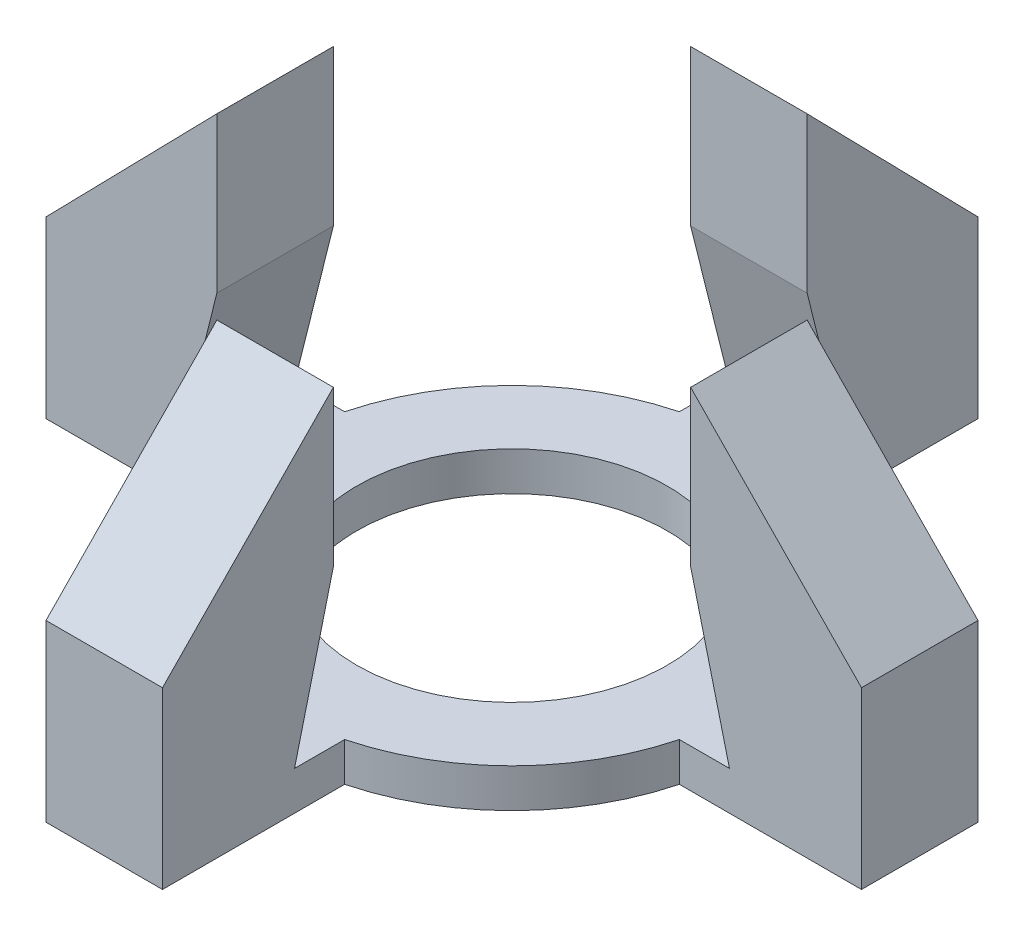
ISO-10303-21;
HEADER;
FILE_DESCRIPTION(('STEP AP214'),'2;1');
FILE_NAME('part.step','',(''),(''),'','','');
FILE_SCHEMA(('AUTOMOTIVE_DESIGN { 1 0 10303 214 1 1 1 1 }'));
ENDSEC;
DATA;
#1=APPLICATION_CONTEXT('core data for automotive mechanical design processes');
#2=APPLICATION_PROTOCOL_DEFINITION('international standard','automotive_design',2000,#1);
#3=PRODUCT_CONTEXT('',#1,'mechanical');
#4=PRODUCT('Part','Part','',(#3));
#5=PRODUCT_RELATED_PRODUCT_CATEGORY('part','',(#4));
#6=PRODUCT_DEFINITION_FORMATION('','',#4);
#7=PRODUCT_DEFINITION_CONTEXT('part definition',#1,'design');
#8=PRODUCT_DEFINITION('design','',#6,#7);
#9=PRODUCT_DEFINITION_SHAPE('','',#8);
#10=(LENGTH_UNIT() NAMED_UNIT(*) SI_UNIT(.MILLI.,.METRE.));
#11=(NAMED_UNIT(*) PLANE_ANGLE_UNIT() SI_UNIT($,.RADIAN.));
#12=(NAMED_UNIT(*) SI_UNIT($,.STERADIAN.) SOLID_ANGLE_UNIT());
#13=UNCERTAINTY_MEASURE_WITH_UNIT(LENGTH_MEASURE(1.E-05),#10,'distance_accuracy_value','');
#14=(GEOMETRIC_REPRESENTATION_CONTEXT(3) GLOBAL_UNCERTAINTY_ASSIGNED_CONTEXT((#13)) GLOBAL_UNIT_ASSIGNED_CONTEXT((#10,
#11,#12)) REPRESENTATION_CONTEXT('',''));
#15=CARTESIAN_POINT('',(0.,0.,0.));
#16=DIRECTION('',(0.,0.,1.));
#17=DIRECTION('',(1.,0.,0.));
#18=AXIS2_PLACEMENT_3D('',#15,#16,#17);
#19=CARTESIAN_POINT('',(-7.5,5.,0.));
#20=DIRECTION('',(1.,0.,0.));
#21=DIRECTION('',(0.,0.,-1.));
#22=AXIS2_PLACEMENT_3D('',#19,#20,#21);
#23=PLANE('',#22);
#24=DIRECTION('',(0.,0.970142500145332,-0.242535625036333));
#25=VECTOR('',#24,1.);
#26=CARTESIAN_POINT('',(-7.49999999999999,8.64705882352941,34.5882352941177));
#27=LINE('',#26,#25);
#28=CARTESIAN_POINT('',(-7.49999999999999,5.,35.5));
#29=VERTEX_POINT('',#28);
#30=CARTESIAN_POINT('',(-7.5,25.,30.5));
#31=VERTEX_POINT('',#30);
#32=EDGE_CURVE('E135',#29,#31,#27,.T.);
#33=ORIENTED_EDGE('',*,*,#32,.F.);
#34=DIRECTION('',(0.,0.,1.));
#35=VECTOR('',#34,1.);
#36=CARTESIAN_POINT('',(-7.5,5.,0.));
#37=LINE('',#36,#35);
#38=CARTESIAN_POINT('',(-7.5,5.,29.0473750965556));
#39=VERTEX_POINT('',#38);
#40=EDGE_CURVE('E344',#39,#29,#37,.T.);
#41=ORIENTED_EDGE('',*,*,#40,.F.);
#42=DIRECTION('',(0.,-1.,0.));
#43=VECTOR('',#42,1.);
#44=CARTESIAN_POINT('',(-7.5,5.,29.0473750965556));
#45=LINE('',#44,#43);
#46=CARTESIAN_POINT('',(-7.5,0.,29.0473750965556));
#47=VERTEX_POINT('',#46);
#48=EDGE_CURVE('E12',#39,#47,#45,.T.);
#49=ORIENTED_EDGE('',*,*,#48,.T.);
#50=DIRECTION('',(0.,0.,1.));
#51=VECTOR('',#50,1.);
#52=CARTESIAN_POINT('',(-7.5,0.,0.));
#53=LINE('',#52,#51);
#54=CARTESIAN_POINT('',(-7.5,0.,52.5));
#55=VERTEX_POINT('',#54);
#56=EDGE_CURVE('E386',#47,#55,#53,.T.);
#57=ORIENTED_EDGE('',*,*,#56,.T.);
#58=DIRECTION('',(0.,-1.,0.));
#59=VECTOR('',#58,1.);
#60=CARTESIAN_POINT('',(-7.5,5.,52.5));
#61=LINE('',#60,#59);
#62=CARTESIAN_POINT('',(-7.5,22.5,52.5));
#63=VERTEX_POINT('',#62);
#64=EDGE_CURVE('E128',#63,#55,#61,.T.);
#65=ORIENTED_EDGE('',*,*,#64,.F.);
#66=DIRECTION('',(0.,-0.715006669013058,0.699117631923879));
#67=VECTOR('',#66,1.);
#68=CARTESIAN_POINT('',(-7.49999999999999,37.2405958091391,38.0869729866196));
#69=LINE('',#68,#67);
#70=CARTESIAN_POINT('',(-7.49999999999999,45.,30.5));
#71=VERTEX_POINT('',#70);
#72=EDGE_CURVE('E526',#71,#63,#69,.T.);
#73=ORIENTED_EDGE('',*,*,#72,.F.);
#74=DIRECTION('',(0.,-1.,0.));
#75=VECTOR('',#74,1.);
#76=CARTESIAN_POINT('',(-7.5,45.,30.5));
#77=LINE('',#76,#75);
#78=EDGE_CURVE('E330',#71,#31,#77,.T.);
#79=ORIENTED_EDGE('',*,*,#78,.T.);
#80=EDGE_LOOP('',(#33,#41,#49,#57,#65,#73,#79));
#81=FACE_BOUND('',#80,.T.);
#82=ADVANCED_FACE('F119',(#81),#23,.F.);
#83=CARTESIAN_POINT('',(7.5,5.,0.));
#84=DIRECTION('',(-1.,0.,0.));
#85=DIRECTION('',(0.,0.,1.));
#86=AXIS2_PLACEMENT_3D('',#83,#84,#85);
#87=PLANE('',#86);
#88=DIRECTION('',(0.,0.,-1.));
#89=VECTOR('',#88,1.);
#90=CARTESIAN_POINT('',(7.5,5.,0.));
#91=LINE('',#90,#89);
#92=CARTESIAN_POINT('',(7.5,5.,35.5));
#93=VERTEX_POINT('',#92);
#94=CARTESIAN_POINT('',(7.5,5.,29.0473750965556));
#95=VERTEX_POINT('',#94);
#96=EDGE_CURVE('E323',#93,#95,#91,.T.);
#97=ORIENTED_EDGE('',*,*,#96,.F.);
#98=DIRECTION('',(0.,-0.970142500145332,0.242535625036333));
#99=VECTOR('',#98,1.);
#100=CARTESIAN_POINT('',(7.5,8.64705882352941,34.5882352941177));
#101=LINE('',#100,#99);
#102=CARTESIAN_POINT('',(7.5,25.,30.5));
#103=VERTEX_POINT('',#102);
#104=EDGE_CURVE('E308',#103,#93,#101,.T.);
#105=ORIENTED_EDGE('',*,*,#104,.F.);
#106=DIRECTION('',(0.,-1.,0.));
#107=VECTOR('',#106,1.);
#108=CARTESIAN_POINT('',(7.5,45.,30.5));
#109=LINE('',#108,#107);
#110=CARTESIAN_POINT('',(7.5,45.,30.5));
#111=VERTEX_POINT('',#110);
#112=EDGE_CURVE('E320',#111,#103,#109,.T.);
#113=ORIENTED_EDGE('',*,*,#112,.F.);
#114=DIRECTION('',(0.,0.715006669013058,-0.699117631923879));
#115=VECTOR('',#114,1.);
#116=CARTESIAN_POINT('',(7.5,37.2405958091391,38.0869729866196));
#117=LINE('',#116,#115);
#118=CARTESIAN_POINT('',(7.5,22.5,52.5));
#119=VERTEX_POINT('',#118);
#120=EDGE_CURVE('E519',#119,#111,#117,.T.);
#121=ORIENTED_EDGE('',*,*,#120,.F.);
#122=DIRECTION('',(0.,-1.,0.));
#123=VECTOR('',#122,1.);
#124=CARTESIAN_POINT('',(7.5,5.,52.5));
#125=LINE('',#124,#123);
#126=CARTESIAN_POINT('',(7.5,0.,52.5));
#127=VERTEX_POINT('',#126);
#128=EDGE_CURVE('E488',#119,#127,#125,.T.);
#129=ORIENTED_EDGE('',*,*,#128,.T.);
#130=DIRECTION('',(0.,0.,-1.));
#131=VECTOR('',#130,1.);
#132=CARTESIAN_POINT('',(7.5,0.,0.));
#133=LINE('',#132,#131);
#134=CARTESIAN_POINT('',(7.5,0.,29.0473750965556));
#135=VERTEX_POINT('',#134);
#136=EDGE_CURVE('E395',#127,#135,#133,.T.);
#137=ORIENTED_EDGE('',*,*,#136,.T.);
#138=DIRECTION('',(0.,-1.,0.));
#139=VECTOR('',#138,1.);
#140=CARTESIAN_POINT('',(7.5,5.,29.0473750965556));
#141=LINE('',#140,#139);
#142=EDGE_CURVE('E484',#95,#135,#141,.T.);
#143=ORIENTED_EDGE('',*,*,#142,.F.);
#144=EDGE_LOOP('',(#97,#105,#113,#121,#129,#137,#143));
#145=FACE_BOUND('',#144,.T.);
#146=ADVANCED_FACE('F318',(#145),#87,.F.);
#147=CARTESIAN_POINT('',(0.,5.,7.50000000000002));
#148=DIRECTION('',(0.,0.,-1.));
#149=DIRECTION('',(-1.,0.,0.));
#150=AXIS2_PLACEMENT_3D('',#147,#148,#149);
#151=PLANE('',#150);
#152=DIRECTION('',(-0.242535625036333,0.970142500145332,0.));
#153=VECTOR('',#152,1.);
#154=CARTESIAN_POINT('',(34.5882352941177,8.64705882352942,7.50000000000001));
#155=LINE('',#154,#153);
#156=CARTESIAN_POINT('',(35.5,5.,7.50000000000001));
#157=VERTEX_POINT('',#156);
#158=CARTESIAN_POINT('',(30.5,25.,7.5));
#159=VERTEX_POINT('',#158);
#160=EDGE_CURVE('E143',#157,#159,#155,.T.);
#161=ORIENTED_EDGE('',*,*,#160,.F.);
#162=DIRECTION('',(1.,0.,0.));
#163=VECTOR('',#162,1.);
#164=CARTESIAN_POINT('',(0.,5.,7.50000000000002));
#165=LINE('',#164,#163);
#166=CARTESIAN_POINT('',(29.0473750965556,5.,7.5));
#167=VERTEX_POINT('',#166);
#168=EDGE_CURVE('E353',#167,#157,#165,.T.);
#169=ORIENTED_EDGE('',*,*,#168,.F.);
#170=DIRECTION('',(0.,-1.,0.));
#171=VECTOR('',#170,1.);
#172=CARTESIAN_POINT('',(29.0473750965556,5.,7.5));
#173=LINE('',#172,#171);
#174=CARTESIAN_POINT('',(29.0473750965556,0.,7.5));
#175=VERTEX_POINT('',#174);
#176=EDGE_CURVE('E480',#167,#175,#173,.T.);
#177=ORIENTED_EDGE('',*,*,#176,.T.);
#178=DIRECTION('',(1.,0.,0.));
#179=VECTOR('',#178,1.);
#180=CARTESIAN_POINT('',(0.,0.,7.50000000000002));
#181=LINE('',#180,#179);
#182=CARTESIAN_POINT('',(52.5,0.,7.49999999999999));
#183=VERTEX_POINT('',#182);
#184=EDGE_CURVE('E401',#175,#183,#181,.T.);
#185=ORIENTED_EDGE('',*,*,#184,.T.);
#186=DIRECTION('',(0.,-1.,0.));
#187=VECTOR('',#186,1.);
#188=CARTESIAN_POINT('',(52.5,5.,7.49999999999999));
#189=LINE('',#188,#187);
#190=CARTESIAN_POINT('',(52.5,22.5,7.49999999999999));
#191=VERTEX_POINT('',#190);
#192=EDGE_CURVE('E477',#191,#183,#189,.T.);
#193=ORIENTED_EDGE('',*,*,#192,.F.);
#194=DIRECTION('',(0.699117631923878,-0.715006669013058,0.));
#195=VECTOR('',#194,1.);
#196=CARTESIAN_POINT('',(38.0869729866196,37.2405958091391,7.49999999999999));
#197=LINE('',#196,#195);
#198=CARTESIAN_POINT('',(30.5,45.,7.5));
#199=VERTEX_POINT('',#198);
#200=EDGE_CURVE('E547',#199,#191,#197,.T.);
#201=ORIENTED_EDGE('',*,*,#200,.F.);
#202=DIRECTION('',(0.,-1.,0.));
#203=VECTOR('',#202,1.);
#204=CARTESIAN_POINT('',(30.5,45.,7.5));
#205=LINE('',#204,#203);
#206=EDGE_CURVE('E612',#199,#159,#205,.T.);
#207=ORIENTED_EDGE('',*,*,#206,.T.);
#208=EDGE_LOOP('',(#161,#169,#177,#185,#193,#201,#207));
#209=FACE_BOUND('',#208,.T.);
#210=ADVANCED_FACE('F630',(#209),#151,.F.);
#211=CARTESIAN_POINT('',(0.,5.,-7.49999999999999));
#212=DIRECTION('',(0.,0.,1.));
#213=DIRECTION('',(1.,0.,0.));
#214=AXIS2_PLACEMENT_3D('',#211,#212,#213);
#215=PLANE('',#214);
#216=DIRECTION('',(-1.,0.,0.));
#217=VECTOR('',#216,1.);
#218=CARTESIAN_POINT('',(0.,5.,-7.49999999999999));
#219=LINE('',#218,#217);
#220=CARTESIAN_POINT('',(35.5,5.,-7.5));
#221=VERTEX_POINT('',#220);
#222=CARTESIAN_POINT('',(29.0473750965556,5.,-7.5));
#223=VERTEX_POINT('',#222);
#224=EDGE_CURVE('E356',#221,#223,#219,.T.);
#225=ORIENTED_EDGE('',*,*,#224,.F.);
#226=DIRECTION('',(0.242535625036333,-0.970142500145332,0.));
#227=VECTOR('',#226,1.);
#228=CARTESIAN_POINT('',(34.5882352941177,8.64705882352942,-7.5));
#229=LINE('',#228,#227);
#230=CARTESIAN_POINT('',(30.5,25.,-7.5));
#231=VERTEX_POINT('',#230);
#232=EDGE_CURVE('E529',#231,#221,#229,.T.);
#233=ORIENTED_EDGE('',*,*,#232,.F.);
#234=DIRECTION('',(0.,-1.,0.));
#235=VECTOR('',#234,1.);
#236=CARTESIAN_POINT('',(30.5,45.,-7.5));
#237=LINE('',#236,#235);
#238=CARTESIAN_POINT('',(30.5,45.,-7.5));
#239=VERTEX_POINT('',#238);
#240=EDGE_CURVE('E622',#239,#231,#237,.T.);
#241=ORIENTED_EDGE('',*,*,#240,.F.);
#242=DIRECTION('',(-0.699117631923878,0.715006669013058,0.));
#243=VECTOR('',#242,1.);
#244=CARTESIAN_POINT('',(38.0869729866196,37.2405958091391,-7.5));
#245=LINE('',#244,#243);
#246=CARTESIAN_POINT('',(52.5,22.5,-7.50000000000001));
#247=VERTEX_POINT('',#246);
#248=EDGE_CURVE('E541',#247,#239,#245,.T.);
#249=ORIENTED_EDGE('',*,*,#248,.F.);
#250=DIRECTION('',(0.,-1.,0.));
#251=VECTOR('',#250,1.);
#252=CARTESIAN_POINT('',(52.5,5.,-7.50000000000001));
#253=LINE('',#252,#251);
#254=CARTESIAN_POINT('',(52.5,0.,-7.50000000000001));
#255=VERTEX_POINT('',#254);
#256=EDGE_CURVE('E474',#247,#255,#253,.T.);
#257=ORIENTED_EDGE('',*,*,#256,.T.);
#258=DIRECTION('',(-1.,0.,0.));
#259=VECTOR('',#258,1.);
#260=CARTESIAN_POINT('',(0.,0.,-7.49999999999999));
#261=LINE('',#260,#259);
#262=CARTESIAN_POINT('',(29.0473750965556,0.,-7.5));
#263=VERTEX_POINT('',#262);
#264=EDGE_CURVE('E409',#255,#263,#261,.T.);
#265=ORIENTED_EDGE('',*,*,#264,.T.);
#266=DIRECTION('',(0.,-1.,0.));
#267=VECTOR('',#266,1.);
#268=CARTESIAN_POINT('',(29.0473750965556,5.,-7.5));
#269=LINE('',#268,#267);
#270=EDGE_CURVE('E470',#223,#263,#269,.T.);
#271=ORIENTED_EDGE('',*,*,#270,.F.);
#272=EDGE_LOOP('',(#225,#233,#241,#249,#257,#265,#271));
#273=FACE_BOUND('',#272,.T.);
#274=ADVANCED_FACE('F638',(#273),#215,.F.);
#275=CARTESIAN_POINT('',(7.49999999999999,5.,0.));
#276=DIRECTION('',(-1.,0.,0.));
#277=DIRECTION('',(0.,0.,1.));
#278=AXIS2_PLACEMENT_3D('',#275,#276,#277);
#279=PLANE('',#278);
#280=DIRECTION('',(0.,0.970142500145332,0.242535625036333));
#281=VECTOR('',#280,1.);
#282=CARTESIAN_POINT('',(7.49999999999999,8.64705882352941,-34.5882352941177));
#283=LINE('',#282,#281);
#284=CARTESIAN_POINT('',(7.49999999999999,5.,-35.5));
#285=VERTEX_POINT('',#284);
#286=CARTESIAN_POINT('',(7.49999999999999,25.,-30.5));
#287=VERTEX_POINT('',#286);
#288=EDGE_CURVE('E559',#285,#287,#283,.T.);
#289=ORIENTED_EDGE('',*,*,#288,.F.);
#290=DIRECTION('',(0.,0.,-1.));
#291=VECTOR('',#290,1.);
#292=CARTESIAN_POINT('',(7.49999999999999,5.,0.));
#293=LINE('',#292,#291);
#294=CARTESIAN_POINT('',(7.49999999999999,5.,-29.0473750965556));
#295=VERTEX_POINT('',#294);
#296=EDGE_CURVE('E362',#295,#285,#293,.T.);
#297=ORIENTED_EDGE('',*,*,#296,.F.);
#298=DIRECTION('',(0.,-1.,0.));
#299=VECTOR('',#298,1.);
#300=CARTESIAN_POINT('',(7.49999999999999,5.,-29.0473750965556));
#301=LINE('',#300,#299);
#302=CARTESIAN_POINT('',(7.49999999999999,0.,-29.0473750965556));
#303=VERTEX_POINT('',#302);
#304=EDGE_CURVE('E466',#295,#303,#301,.T.);
#305=ORIENTED_EDGE('',*,*,#304,.T.);
#306=DIRECTION('',(0.,0.,-1.));
#307=VECTOR('',#306,1.);
#308=CARTESIAN_POINT('',(7.49999999999999,0.,0.));
#309=LINE('',#308,#307);
#310=CARTESIAN_POINT('',(7.49999999999999,0.,-52.5));
#311=VERTEX_POINT('',#310);
#312=EDGE_CURVE('E415',#303,#311,#309,.T.);
#313=ORIENTED_EDGE('',*,*,#312,.T.);
#314=DIRECTION('',(0.,-1.,0.));
#315=VECTOR('',#314,1.);
#316=CARTESIAN_POINT('',(7.49999999999999,5.,-52.5));
#317=LINE('',#316,#315);
#318=CARTESIAN_POINT('',(7.49999999999999,22.5,-52.5));
#319=VERTEX_POINT('',#318);
#320=EDGE_CURVE('E463',#319,#311,#317,.T.);
#321=ORIENTED_EDGE('',*,*,#320,.F.);
#322=DIRECTION('',(0.,-0.715006669013058,-0.699117631923879));
#323=VECTOR('',#322,1.);
#324=CARTESIAN_POINT('',(7.49999999999999,37.2405958091391,-38.0869729866196));
#325=LINE('',#324,#323);
#326=CARTESIAN_POINT('',(7.49999999999999,45.,-30.5));
#327=VERTEX_POINT('',#326);
#328=EDGE_CURVE('E570',#327,#319,#325,.T.);
#329=ORIENTED_EDGE('',*,*,#328,.F.);
#330=DIRECTION('',(0.,-1.,0.));
#331=VECTOR('',#330,1.);
#332=CARTESIAN_POINT('',(7.49999999999999,45.,-30.5));
#333=LINE('',#332,#331);
#334=EDGE_CURVE('E600',#327,#287,#333,.T.);
#335=ORIENTED_EDGE('',*,*,#334,.T.);
#336=EDGE_LOOP('',(#289,#297,#305,#313,#321,#329,#335));
#337=FACE_BOUND('',#336,.T.);
#338=ADVANCED_FACE('F651',(#337),#279,.F.);
#339=CARTESIAN_POINT('',(-7.5,5.,0.));
#340=DIRECTION('',(1.,0.,0.));
#341=DIRECTION('',(0.,0.,-1.));
#342=AXIS2_PLACEMENT_3D('',#339,#340,#341);
#343=PLANE('',#342);
#344=DIRECTION('',(0.,0.,1.));
#345=VECTOR('',#344,1.);
#346=CARTESIAN_POINT('',(-7.5,5.,0.));
#347=LINE('',#346,#345);
#348=CARTESIAN_POINT('',(-7.50000000000001,5.,-35.5));
#349=VERTEX_POINT('',#348);
#350=CARTESIAN_POINT('',(-7.50000000000001,5.,-29.0473750965556));
#351=VERTEX_POINT('',#350);
#352=EDGE_CURVE('E365',#349,#351,#347,.T.);
#353=ORIENTED_EDGE('',*,*,#352,.F.);
#354=DIRECTION('',(0.,-0.970142500145332,-0.242535625036333));
#355=VECTOR('',#354,1.);
#356=CARTESIAN_POINT('',(-7.50000000000001,8.64705882352941,-34.5882352941177));
#357=LINE('',#356,#355);
#358=CARTESIAN_POINT('',(-7.50000000000001,25.,-30.5));
#359=VERTEX_POINT('',#358);
#360=EDGE_CURVE('E550',#359,#349,#357,.T.);
#361=ORIENTED_EDGE('',*,*,#360,.F.);
#362=DIRECTION('',(0.,-1.,0.));
#363=VECTOR('',#362,1.);
#364=CARTESIAN_POINT('',(-7.50000000000001,45.,-30.5));
#365=LINE('',#364,#363);
#366=CARTESIAN_POINT('',(-7.50000000000001,45.,-30.5));
#367=VERTEX_POINT('',#366);
#368=EDGE_CURVE('E611',#367,#359,#365,.T.);
#369=ORIENTED_EDGE('',*,*,#368,.F.);
#370=DIRECTION('',(0.,0.715006669013058,0.699117631923879));
#371=VECTOR('',#370,1.);
#372=CARTESIAN_POINT('',(-7.50000000000001,37.2405958091391,-38.0869729866195));
#373=LINE('',#372,#371);
#374=CARTESIAN_POINT('',(-7.50000000000001,22.5,-52.5));
#375=VERTEX_POINT('',#374);
#376=EDGE_CURVE('E564',#375,#367,#373,.T.);
#377=ORIENTED_EDGE('',*,*,#376,.F.);
#378=DIRECTION('',(0.,-1.,0.));
#379=VECTOR('',#378,1.);
#380=CARTESIAN_POINT('',(-7.50000000000001,5.,-52.5));
#381=LINE('',#380,#379);
#382=CARTESIAN_POINT('',(-7.50000000000001,0.,-52.5));
#383=VERTEX_POINT('',#382);
#384=EDGE_CURVE('E460',#375,#383,#381,.T.);
#385=ORIENTED_EDGE('',*,*,#384,.T.);
#386=DIRECTION('',(0.,0.,1.));
#387=VECTOR('',#386,1.);
#388=CARTESIAN_POINT('',(-7.5,0.,0.));
#389=LINE('',#388,#387);
#390=CARTESIAN_POINT('',(-7.50000000000001,0.,-29.0473750965556));
#391=VERTEX_POINT('',#390);
#392=EDGE_CURVE('E423',#383,#391,#389,.T.);
#393=ORIENTED_EDGE('',*,*,#392,.T.);
#394=DIRECTION('',(0.,-1.,0.));
#395=VECTOR('',#394,1.);
#396=CARTESIAN_POINT('',(-7.50000000000001,5.,-29.0473750965556));
#397=LINE('',#396,#395);
#398=EDGE_CURVE('E456',#351,#391,#397,.T.);
#399=ORIENTED_EDGE('',*,*,#398,.F.);
#400=EDGE_LOOP('',(#353,#361,#369,#377,#385,#393,#399));
#401=FACE_BOUND('',#400,.T.);
#402=ADVANCED_FACE('F663',(#401),#343,.F.);
#403=CARTESIAN_POINT('',(0.,5.,-7.5));
#404=DIRECTION('',(0.,0.,1.));
#405=DIRECTION('',(1.,0.,0.));
#406=AXIS2_PLACEMENT_3D('',#403,#404,#405);
#407=PLANE('',#406);
#408=DIRECTION('',(0.242535625036333,0.970142500145332,0.));
#409=VECTOR('',#408,1.);
#410=CARTESIAN_POINT('',(-34.5882352941177,8.64705882352941,-7.49999999999999));
#411=LINE('',#410,#409);
#412=CARTESIAN_POINT('',(-35.5,5.,-7.49999999999999));
#413=VERTEX_POINT('',#412);
#414=CARTESIAN_POINT('',(-30.5,25.,-7.49999999999999));
#415=VERTEX_POINT('',#414);
#416=EDGE_CURVE('E582',#413,#415,#411,.T.);
#417=ORIENTED_EDGE('',*,*,#416,.F.);
#418=DIRECTION('',(-1.,0.,0.));
#419=VECTOR('',#418,1.);
#420=CARTESIAN_POINT('',(0.,5.,-7.5));
#421=LINE('',#420,#419);
#422=CARTESIAN_POINT('',(-29.0473750965556,5.,-7.49999999999999));
#423=VERTEX_POINT('',#422);
#424=EDGE_CURVE('E371',#423,#413,#421,.T.);
#425=ORIENTED_EDGE('',*,*,#424,.F.);
#426=DIRECTION('',(0.,-1.,0.));
#427=VECTOR('',#426,1.);
#428=CARTESIAN_POINT('',(-29.0473750965556,5.,-7.49999999999999));
#429=LINE('',#428,#427);
#430=CARTESIAN_POINT('',(-29.0473750965556,0.,-7.49999999999999));
#431=VERTEX_POINT('',#430);
#432=EDGE_CURVE('E452',#423,#431,#429,.T.);
#433=ORIENTED_EDGE('',*,*,#432,.T.);
#434=DIRECTION('',(-1.,0.,0.));
#435=VECTOR('',#434,1.);
#436=CARTESIAN_POINT('',(0.,0.,-7.5));
#437=LINE('',#436,#435);
#438=CARTESIAN_POINT('',(-52.5,0.,-7.49999999999998));
#439=VERTEX_POINT('',#438);
#440=EDGE_CURVE('E429',#431,#439,#437,.T.);
#441=ORIENTED_EDGE('',*,*,#440,.T.);
#442=DIRECTION('',(0.,-1.,0.));
#443=VECTOR('',#442,1.);
#444=CARTESIAN_POINT('',(-52.5,5.,-7.49999999999998));
#445=LINE('',#444,#443);
#446=CARTESIAN_POINT('',(-52.5,22.5,-7.49999999999998));
#447=VERTEX_POINT('',#446);
#448=EDGE_CURVE('E449',#447,#439,#445,.T.);
#449=ORIENTED_EDGE('',*,*,#448,.F.);
#450=DIRECTION('',(-0.699117631923879,-0.715006669013058,0.));
#451=VECTOR('',#450,1.);
#452=CARTESIAN_POINT('',(-38.0869729866195,37.2405958091391,-7.49999999999999));
#453=LINE('',#452,#451);
#454=CARTESIAN_POINT('',(-30.5,45.,-7.49999999999999));
#455=VERTEX_POINT('',#454);
#456=EDGE_CURVE('E336',#455,#447,#453,.T.);
#457=ORIENTED_EDGE('',*,*,#456,.F.);
#458=DIRECTION('',(0.,-1.,0.));
#459=VECTOR('',#458,1.);
#460=CARTESIAN_POINT('',(-30.5,45.,-7.49999999999999));
#461=LINE('',#460,#459);
#462=EDGE_CURVE('E387',#455,#415,#461,.T.);
#463=ORIENTED_EDGE('',*,*,#462,.T.);
#464=EDGE_LOOP('',(#417,#425,#433,#441,#449,#457,#463));
#465=FACE_BOUND('',#464,.T.);
#466=ADVANCED_FACE('F676',(#465),#407,.F.);
#467=CARTESIAN_POINT('',(0.,5.,7.50000000000002));
#468=DIRECTION('',(0.,0.,-1.));
#469=DIRECTION('',(-1.,0.,0.));
#470=AXIS2_PLACEMENT_3D('',#467,#468,#469);
#471=PLANE('',#470);
#472=DIRECTION('',(1.,0.,0.));
#473=VECTOR('',#472,1.);
#474=CARTESIAN_POINT('',(0.,5.,7.50000000000002));
#475=LINE('',#474,#473);
#476=CARTESIAN_POINT('',(-35.5,5.,7.50000000000002));
#477=VERTEX_POINT('',#476);
#478=CARTESIAN_POINT('',(-29.0473750965556,5.,7.50000000000002));
#479=VERTEX_POINT('',#478);
#480=EDGE_CURVE('E374',#477,#479,#475,.T.);
#481=ORIENTED_EDGE('',*,*,#480,.F.);
#482=DIRECTION('',(-0.242535625036333,-0.970142500145332,0.));
#483=VECTOR('',#482,1.);
#484=CARTESIAN_POINT('',(-34.5882352941177,8.64705882352941,7.50000000000002));
#485=LINE('',#484,#483);
#486=CARTESIAN_POINT('',(-30.5,25.,7.50000000000002));
#487=VERTEX_POINT('',#486);
#488=EDGE_CURVE('E573',#487,#477,#485,.T.);
#489=ORIENTED_EDGE('',*,*,#488,.F.);
#490=DIRECTION('',(0.,-1.,0.));
#491=VECTOR('',#490,1.);
#492=CARTESIAN_POINT('',(-30.5,45.,7.50000000000002));
#493=LINE('',#492,#491);
#494=CARTESIAN_POINT('',(-30.5,45.,7.50000000000002));
#495=VERTEX_POINT('',#494);
#496=EDGE_CURVE('E599',#495,#487,#493,.T.);
#497=ORIENTED_EDGE('',*,*,#496,.F.);
#498=DIRECTION('',(0.699117631923879,0.715006669013058,0.));
#499=VECTOR('',#498,1.);
#500=CARTESIAN_POINT('',(-38.0869729866195,37.2405958091391,7.50000000000002));
#501=LINE('',#500,#499);
#502=CARTESIAN_POINT('',(-52.5,22.5,7.50000000000002));
#503=VERTEX_POINT('',#502);
#504=EDGE_CURVE('E587',#503,#495,#501,.T.);
#505=ORIENTED_EDGE('',*,*,#504,.F.);
#506=DIRECTION('',(0.,-1.,0.));
#507=VECTOR('',#506,1.);
#508=CARTESIAN_POINT('',(-52.5,5.,7.50000000000002));
#509=LINE('',#508,#507);
#510=CARTESIAN_POINT('',(-52.5,0.,7.50000000000002));
#511=VERTEX_POINT('',#510);
#512=EDGE_CURVE('E446',#503,#511,#509,.T.);
#513=ORIENTED_EDGE('',*,*,#512,.T.);
#514=DIRECTION('',(1.,0.,0.));
#515=VECTOR('',#514,1.);
#516=CARTESIAN_POINT('',(0.,0.,7.50000000000002));
#517=LINE('',#516,#515);
#518=CARTESIAN_POINT('',(-29.0473750965556,0.,7.50000000000002));
#519=VERTEX_POINT('',#518);
#520=EDGE_CURVE('E437',#511,#519,#517,.T.);
#521=ORIENTED_EDGE('',*,*,#520,.T.);
#522=DIRECTION('',(0.,-1.,0.));
#523=VECTOR('',#522,1.);
#524=CARTESIAN_POINT('',(-29.0473750965556,5.,7.50000000000002));
#525=LINE('',#524,#523);
#526=EDGE_CURVE('E381',#479,#519,#525,.T.);
#527=ORIENTED_EDGE('',*,*,#526,.F.);
#528=EDGE_LOOP('',(#481,#489,#497,#505,#513,#521,#527));
#529=FACE_BOUND('',#528,.T.);
#530=ADVANCED_FACE('F688',(#529),#471,.F.);
#531=CARTESIAN_POINT('',(0.,5.,0.));
#532=DIRECTION('',(0.,1.,0.));
#533=DIRECTION('',(0.,0.,1.));
#534=AXIS2_PLACEMENT_3D('',#531,#532,#533);
#535=PLANE('',#534);
#536=CARTESIAN_POINT('',(0.,5.,0.));
#537=DIRECTION('',(0.,1.,0.));
#538=DIRECTION('',(0.,0.,1.));
#539=AXIS2_PLACEMENT_3D('',#536,#537,#538);
#540=CIRCLE('',#539,20.);
#541=CARTESIAN_POINT('',(0.,5.,20.));
#542=VERTEX_POINT('',#541);
#543=EDGE_CURVE('E377',#542,#542,#540,.T.);
#544=ORIENTED_EDGE('',*,*,#543,.F.);
#545=EDGE_LOOP('',(#544));
#546=FACE_BOUND('',#545,.T.);
#547=ORIENTED_EDGE('',*,*,#424,.T.);
#548=DIRECTION('',(0.,0.,1.));
#549=VECTOR('',#548,1.);
#550=CARTESIAN_POINT('',(-35.5,5.,-52.501));
#551=LINE('',#550,#549);
#552=EDGE_CURVE('E578',#413,#477,#551,.T.);
#553=ORIENTED_EDGE('',*,*,#552,.T.);
#554=ORIENTED_EDGE('',*,*,#480,.T.);
#555=CARTESIAN_POINT('',(0.,5.,0.));
#556=DIRECTION('',(0.,1.,0.));
#557=DIRECTION('',(0.,0.,1.));
#558=AXIS2_PLACEMENT_3D('',#555,#556,#557);
#559=CIRCLE('',#558,30.);
#560=EDGE_CURVE('E340',#479,#39,#559,.T.);
#561=ORIENTED_EDGE('',*,*,#560,.T.);
#562=ORIENTED_EDGE('',*,*,#40,.T.);
#563=DIRECTION('',(1.,0.,0.));
#564=VECTOR('',#563,1.);
#565=CARTESIAN_POINT('',(-52.501,5.,35.5));
#566=LINE('',#565,#564);
#567=EDGE_CURVE('E314',#29,#93,#566,.T.);
#568=ORIENTED_EDGE('',*,*,#567,.T.);
#569=ORIENTED_EDGE('',*,*,#96,.T.);
#570=CARTESIAN_POINT('',(0.,5.,0.));
#571=DIRECTION('',(0.,1.,0.));
#572=DIRECTION('',(0.,0.,1.));
#573=AXIS2_PLACEMENT_3D('',#570,#571,#572);
#574=CIRCLE('',#573,30.);
#575=EDGE_CURVE('E350',#95,#167,#574,.T.);
#576=ORIENTED_EDGE('',*,*,#575,.T.);
#577=ORIENTED_EDGE('',*,*,#168,.T.);
#578=DIRECTION('',(0.,0.,-1.));
#579=VECTOR('',#578,1.);
#580=CARTESIAN_POINT('',(35.5,5.,52.501));
#581=LINE('',#580,#579);
#582=EDGE_CURVE('E534',#157,#221,#581,.T.);
#583=ORIENTED_EDGE('',*,*,#582,.T.);
#584=ORIENTED_EDGE('',*,*,#224,.T.);
#585=CARTESIAN_POINT('',(0.,5.,0.));
#586=DIRECTION('',(0.,1.,0.));
#587=DIRECTION('',(0.,0.,1.));
#588=AXIS2_PLACEMENT_3D('',#585,#586,#587);
#589=CIRCLE('',#588,30.);
#590=EDGE_CURVE('E359',#223,#295,#589,.T.);
#591=ORIENTED_EDGE('',*,*,#590,.T.);
#592=ORIENTED_EDGE('',*,*,#296,.T.);
#593=DIRECTION('',(-1.,0.,0.));
#594=VECTOR('',#593,1.);
#595=CARTESIAN_POINT('',(52.501,5.,-35.5));
#596=LINE('',#595,#594);
#597=EDGE_CURVE('E555',#285,#349,#596,.T.);
#598=ORIENTED_EDGE('',*,*,#597,.T.);
#599=ORIENTED_EDGE('',*,*,#352,.T.);
#600=CARTESIAN_POINT('',(0.,5.,0.));
#601=DIRECTION('',(0.,1.,0.));
#602=DIRECTION('',(0.,0.,1.));
#603=AXIS2_PLACEMENT_3D('',#600,#601,#602);
#604=CIRCLE('',#603,30.);
#605=EDGE_CURVE('E368',#351,#423,#604,.T.);
#606=ORIENTED_EDGE('',*,*,#605,.T.);
#607=EDGE_LOOP('',(#547,#553,#554,#561,#562,#568,#569,#576,#577,#583,#584,#591,#592,#598,#599,#606));
#608=FACE_BOUND('',#607,.T.);
#609=ADVANCED_FACE('F514',(#546,#608),#535,.T.);
#610=CARTESIAN_POINT('',(0.,5.,0.));
#611=DIRECTION('',(0.,-1.,0.));
#612=DIRECTION('',(0.,0.,-1.));
#613=AXIS2_PLACEMENT_3D('',#610,#611,#612);
#614=CYLINDRICAL_SURFACE('',#613,30.);
#615=CARTESIAN_POINT('',(0.,0.,0.));
#616=DIRECTION('',(0.,1.,0.));
#617=DIRECTION('',(0.,0.,1.));
#618=AXIS2_PLACEMENT_3D('',#615,#616,#617);
#619=CIRCLE('',#618,30.);
#620=EDGE_CURVE('E382',#519,#47,#619,.T.);
#621=ORIENTED_EDGE('',*,*,#620,.T.);
#622=ORIENTED_EDGE('',*,*,#48,.F.);
#623=ORIENTED_EDGE('',*,*,#560,.F.);
#624=ORIENTED_EDGE('',*,*,#526,.T.);
#625=EDGE_LOOP('',(#621,#622,#623,#624));
#626=FACE_BOUND('',#625,.T.);
#627=ADVANCED_FACE('F121',(#626),#614,.T.);
#628=CARTESIAN_POINT('',(0.,5.,52.5));
#629=DIRECTION('',(0.,0.,-1.));
#630=DIRECTION('',(-1.,0.,0.));
#631=AXIS2_PLACEMENT_3D('',#628,#629,#630);
#632=PLANE('',#631);
#633=ORIENTED_EDGE('',*,*,#128,.F.);
#634=DIRECTION('',(1.,0.,0.));
#635=VECTOR('',#634,1.);
#636=CARTESIAN_POINT('',(-52.501,22.5,52.5));
#637=LINE('',#636,#635);
#638=EDGE_CURVE('E498',#63,#119,#637,.T.);
#639=ORIENTED_EDGE('',*,*,#638,.F.);
#640=ORIENTED_EDGE('',*,*,#64,.T.);
#641=DIRECTION('',(1.,0.,0.));
#642=VECTOR('',#641,1.);
#643=CARTESIAN_POINT('',(0.,0.,52.5));
#644=LINE('',#643,#642);
#645=EDGE_CURVE('E391',#55,#127,#644,.T.);
#646=ORIENTED_EDGE('',*,*,#645,.T.);
#647=EDGE_LOOP('',(#633,#639,#640,#646));
#648=FACE_BOUND('',#647,.T.);
#649=ADVANCED_FACE('F495',(#648),#632,.F.);
#650=CARTESIAN_POINT('',(0.,5.,0.));
#651=DIRECTION('',(0.,-1.,0.));
#652=DIRECTION('',(0.,0.,-1.));
#653=AXIS2_PLACEMENT_3D('',#650,#651,#652);
#654=CYLINDRICAL_SURFACE('',#653,30.);
#655=CARTESIAN_POINT('',(0.,0.,0.));
#656=DIRECTION('',(0.,1.,0.));
#657=DIRECTION('',(0.,0.,1.));
#658=AXIS2_PLACEMENT_3D('',#655,#656,#657);
#659=CIRCLE('',#658,30.);
#660=EDGE_CURVE('E398',#135,#175,#659,.T.);
#661=ORIENTED_EDGE('',*,*,#660,.T.);
#662=ORIENTED_EDGE('',*,*,#176,.F.);
#663=ORIENTED_EDGE('',*,*,#575,.F.);
#664=ORIENTED_EDGE('',*,*,#142,.T.);
#665=EDGE_LOOP('',(#661,#662,#663,#664));
#666=FACE_BOUND('',#665,.T.);
#667=ADVANCED_FACE('F510',(#666),#654,.T.);
#668=CARTESIAN_POINT('',(52.5,5.,0.));
#669=DIRECTION('',(-1.,0.,0.));
#670=DIRECTION('',(0.,0.,1.));
#671=AXIS2_PLACEMENT_3D('',#668,#669,#670);
#672=PLANE('',#671);
#673=ORIENTED_EDGE('',*,*,#256,.F.);
#674=DIRECTION('',(0.,0.,-1.));
#675=VECTOR('',#674,1.);
#676=CARTESIAN_POINT('',(52.5,22.5,52.501));
#677=LINE('',#676,#675);
#678=EDGE_CURVE('E544',#191,#247,#677,.T.);
#679=ORIENTED_EDGE('',*,*,#678,.F.);
#680=ORIENTED_EDGE('',*,*,#192,.T.);
#681=DIRECTION('',(0.,0.,-1.));
#682=VECTOR('',#681,1.);
#683=CARTESIAN_POINT('',(52.5,0.,0.));
#684=LINE('',#683,#682);
#685=EDGE_CURVE('E405',#183,#255,#684,.T.);
#686=ORIENTED_EDGE('',*,*,#685,.T.);
#687=EDGE_LOOP('',(#673,#679,#680,#686));
#688=FACE_BOUND('',#687,.T.);
#689=ADVANCED_FACE('F710',(#688),#672,.F.);
#690=CARTESIAN_POINT('',(0.,5.,0.));
#691=DIRECTION('',(0.,-1.,0.));
#692=DIRECTION('',(0.,0.,-1.));
#693=AXIS2_PLACEMENT_3D('',#690,#691,#692);
#694=CYLINDRICAL_SURFACE('',#693,30.);
#695=CARTESIAN_POINT('',(0.,0.,0.));
#696=DIRECTION('',(0.,1.,0.));
#697=DIRECTION('',(0.,0.,1.));
#698=AXIS2_PLACEMENT_3D('',#695,#696,#697);
#699=CIRCLE('',#698,30.);
#700=EDGE_CURVE('E412',#263,#303,#699,.T.);
#701=ORIENTED_EDGE('',*,*,#700,.T.);
#702=ORIENTED_EDGE('',*,*,#304,.F.);
#703=ORIENTED_EDGE('',*,*,#590,.F.);
#704=ORIENTED_EDGE('',*,*,#270,.T.);
#705=EDGE_LOOP('',(#701,#702,#703,#704));
#706=FACE_BOUND('',#705,.T.);
#707=ADVANCED_FACE('F646',(#706),#694,.T.);
#708=CARTESIAN_POINT('',(0.,5.,-52.5));
#709=DIRECTION('',(0.,0.,1.));
#710=DIRECTION('',(1.,0.,0.));
#711=AXIS2_PLACEMENT_3D('',#708,#709,#710);
#712=PLANE('',#711);
#713=ORIENTED_EDGE('',*,*,#384,.F.);
#714=DIRECTION('',(-1.,0.,0.));
#715=VECTOR('',#714,1.);
#716=CARTESIAN_POINT('',(52.501,22.5,-52.5));
#717=LINE('',#716,#715);
#718=EDGE_CURVE('E567',#319,#375,#717,.T.);
#719=ORIENTED_EDGE('',*,*,#718,.F.);
#720=ORIENTED_EDGE('',*,*,#320,.T.);
#721=DIRECTION('',(-1.,0.,0.));
#722=VECTOR('',#721,1.);
#723=CARTESIAN_POINT('',(0.,0.,-52.5));
#724=LINE('',#723,#722);
#725=EDGE_CURVE('E419',#311,#383,#724,.T.);
#726=ORIENTED_EDGE('',*,*,#725,.T.);
#727=EDGE_LOOP('',(#713,#719,#720,#726));
#728=FACE_BOUND('',#727,.T.);
#729=ADVANCED_FACE('F703',(#728),#712,.F.);
#730=CARTESIAN_POINT('',(0.,5.,0.));
#731=DIRECTION('',(0.,-1.,0.));
#732=DIRECTION('',(0.,0.,-1.));
#733=AXIS2_PLACEMENT_3D('',#730,#731,#732);
#734=CYLINDRICAL_SURFACE('',#733,30.);
#735=CARTESIAN_POINT('',(0.,0.,0.));
#736=DIRECTION('',(0.,1.,0.));
#737=DIRECTION('',(0.,0.,1.));
#738=AXIS2_PLACEMENT_3D('',#735,#736,#737);
#739=CIRCLE('',#738,30.);
#740=EDGE_CURVE('E426',#391,#431,#739,.T.);
#741=ORIENTED_EDGE('',*,*,#740,.T.);
#742=ORIENTED_EDGE('',*,*,#432,.F.);
#743=ORIENTED_EDGE('',*,*,#605,.F.);
#744=ORIENTED_EDGE('',*,*,#398,.T.);
#745=EDGE_LOOP('',(#741,#742,#743,#744));
#746=FACE_BOUND('',#745,.T.);
#747=ADVANCED_FACE('F671',(#746),#734,.T.);
#748=CARTESIAN_POINT('',(-52.5,5.,0.));
#749=DIRECTION('',(1.,0.,0.));
#750=DIRECTION('',(0.,0.,-1.));
#751=AXIS2_PLACEMENT_3D('',#748,#749,#750);
#752=PLANE('',#751);
#753=ORIENTED_EDGE('',*,*,#512,.F.);
#754=DIRECTION('',(0.,0.,1.));
#755=VECTOR('',#754,1.);
#756=CARTESIAN_POINT('',(-52.5,22.5,-52.501));
#757=LINE('',#756,#755);
#758=EDGE_CURVE('E590',#447,#503,#757,.T.);
#759=ORIENTED_EDGE('',*,*,#758,.F.);
#760=ORIENTED_EDGE('',*,*,#448,.T.);
#761=DIRECTION('',(0.,0.,1.));
#762=VECTOR('',#761,1.);
#763=CARTESIAN_POINT('',(-52.5,0.,0.));
#764=LINE('',#763,#762);
#765=EDGE_CURVE('E433',#439,#511,#764,.T.);
#766=ORIENTED_EDGE('',*,*,#765,.T.);
#767=EDGE_LOOP('',(#753,#759,#760,#766));
#768=FACE_BOUND('',#767,.T.);
#769=ADVANCED_FACE('F697',(#768),#752,.F.);
#770=CARTESIAN_POINT('',(0.,5.,0.));
#771=DIRECTION('',(0.,-1.,0.));
#772=DIRECTION('',(0.,0.,-1.));
#773=AXIS2_PLACEMENT_3D('',#770,#771,#772);
#774=CYLINDRICAL_SURFACE('',#773,20.);
#775=ORIENTED_EDGE('',*,*,#543,.T.);
#776=EDGE_LOOP('',(#775));
#777=FACE_BOUND('',#776,.T.);
#778=CARTESIAN_POINT('',(0.,0.,0.));
#779=DIRECTION('',(0.,1.,0.));
#780=DIRECTION('',(0.,0.,1.));
#781=AXIS2_PLACEMENT_3D('',#778,#779,#780);
#782=CIRCLE('',#781,20.);
#783=CARTESIAN_POINT('',(0.,0.,20.));
#784=VERTEX_POINT('',#783);
#785=EDGE_CURVE('E345',#784,#784,#782,.T.);
#786=ORIENTED_EDGE('',*,*,#785,.F.);
#787=EDGE_LOOP('',(#786));
#788=FACE_BOUND('',#787,.T.);
#789=ADVANCED_FACE('F754',(#777,#788),#774,.F.);
#790=CARTESIAN_POINT('',(0.,0.,0.));
#791=DIRECTION('',(0.,1.,0.));
#792=DIRECTION('',(0.,0.,1.));
#793=AXIS2_PLACEMENT_3D('',#790,#791,#792);
#794=PLANE('',#793);
#795=ORIENTED_EDGE('',*,*,#620,.F.);
#796=ORIENTED_EDGE('',*,*,#520,.F.);
#797=ORIENTED_EDGE('',*,*,#765,.F.);
#798=ORIENTED_EDGE('',*,*,#440,.F.);
#799=ORIENTED_EDGE('',*,*,#740,.F.);
#800=ORIENTED_EDGE('',*,*,#392,.F.);
#801=ORIENTED_EDGE('',*,*,#725,.F.);
#802=ORIENTED_EDGE('',*,*,#312,.F.);
#803=ORIENTED_EDGE('',*,*,#700,.F.);
#804=ORIENTED_EDGE('',*,*,#264,.F.);
#805=ORIENTED_EDGE('',*,*,#685,.F.);
#806=ORIENTED_EDGE('',*,*,#184,.F.);
#807=ORIENTED_EDGE('',*,*,#660,.F.);
#808=ORIENTED_EDGE('',*,*,#136,.F.);
#809=ORIENTED_EDGE('',*,*,#645,.F.);
#810=ORIENTED_EDGE('',*,*,#56,.F.);
#811=EDGE_LOOP('',(#795,#796,#797,#798,#799,#800,#801,#802,#803,#804,#805,#806,#807,#808,#809,#810));
#812=FACE_BOUND('',#811,.T.);
#813=ORIENTED_EDGE('',*,*,#785,.T.);
#814=EDGE_LOOP('',(#813));
#815=FACE_BOUND('',#814,.T.);
#816=ADVANCED_FACE('F504',(#812,#815),#794,.F.);
#817=CARTESIAN_POINT('',(0.,45.,30.5));
#818=DIRECTION('',(0.,0.,-1.));
#819=DIRECTION('',(-1.,0.,0.));
#820=AXIS2_PLACEMENT_3D('',#817,#818,#819);
#821=PLANE('',#820);
#822=DIRECTION('',(1.,0.,0.));
#823=VECTOR('',#822,1.);
#824=CARTESIAN_POINT('',(-52.501,25.,30.5));
#825=LINE('',#824,#823);
#826=EDGE_CURVE('E305',#31,#103,#825,.T.);
#827=ORIENTED_EDGE('',*,*,#826,.F.);
#828=ORIENTED_EDGE('',*,*,#78,.F.);
#829=DIRECTION('',(1.,0.,0.));
#830=VECTOR('',#829,1.);
#831=CARTESIAN_POINT('',(0.,45.,30.5));
#832=LINE('',#831,#830);
#833=EDGE_CURVE('E328',#71,#111,#832,.T.);
#834=ORIENTED_EDGE('',*,*,#833,.T.);
#835=ORIENTED_EDGE('',*,*,#112,.T.);
#836=EDGE_LOOP('',(#827,#828,#834,#835));
#837=FACE_BOUND('',#836,.T.);
#838=ADVANCED_FACE('F327',(#837),#821,.T.);
#839=CARTESIAN_POINT('',(30.5,45.,0.));
#840=DIRECTION('',(-1.,0.,0.));
#841=DIRECTION('',(0.,0.,1.));
#842=AXIS2_PLACEMENT_3D('',#839,#840,#841);
#843=PLANE('',#842);
#844=DIRECTION('',(0.,0.,-1.));
#845=VECTOR('',#844,1.);
#846=CARTESIAN_POINT('',(30.5,25.,52.501));
#847=LINE('',#846,#845);
#848=EDGE_CURVE('E533',#159,#231,#847,.T.);
#849=ORIENTED_EDGE('',*,*,#848,.F.);
#850=ORIENTED_EDGE('',*,*,#206,.F.);
#851=DIRECTION('',(0.,0.,-1.));
#852=VECTOR('',#851,1.);
#853=CARTESIAN_POINT('',(30.5,45.,0.));
#854=LINE('',#853,#852);
#855=EDGE_CURVE('E334',#199,#239,#854,.T.);
#856=ORIENTED_EDGE('',*,*,#855,.T.);
#857=ORIENTED_EDGE('',*,*,#240,.T.);
#858=EDGE_LOOP('',(#849,#850,#856,#857));
#859=FACE_BOUND('',#858,.T.);
#860=ADVANCED_FACE('F633',(#859),#843,.T.);
#861=CARTESIAN_POINT('',(0.,45.,-30.5));
#862=DIRECTION('',(0.,0.,1.));
#863=DIRECTION('',(1.,0.,0.));
#864=AXIS2_PLACEMENT_3D('',#861,#862,#863);
#865=PLANE('',#864);
#866=DIRECTION('',(-1.,0.,0.));
#867=VECTOR('',#866,1.);
#868=CARTESIAN_POINT('',(52.501,25.,-30.5));
#869=LINE('',#868,#867);
#870=EDGE_CURVE('E554',#287,#359,#869,.T.);
#871=ORIENTED_EDGE('',*,*,#870,.F.);
#872=ORIENTED_EDGE('',*,*,#334,.F.);
#873=DIRECTION('',(-1.,0.,0.));
#874=VECTOR('',#873,1.);
#875=CARTESIAN_POINT('',(0.,45.,-30.5));
#876=LINE('',#875,#874);
#877=EDGE_CURVE('E607',#327,#367,#876,.T.);
#878=ORIENTED_EDGE('',*,*,#877,.T.);
#879=ORIENTED_EDGE('',*,*,#368,.T.);
#880=EDGE_LOOP('',(#871,#872,#878,#879));
#881=FACE_BOUND('',#880,.T.);
#882=ADVANCED_FACE('F659',(#881),#865,.T.);
#883=CARTESIAN_POINT('',(-30.5,45.,0.));
#884=DIRECTION('',(1.,0.,0.));
#885=DIRECTION('',(0.,0.,-1.));
#886=AXIS2_PLACEMENT_3D('',#883,#884,#885);
#887=PLANE('',#886);
#888=DIRECTION('',(0.,0.,1.));
#889=VECTOR('',#888,1.);
#890=CARTESIAN_POINT('',(-30.5,25.,-52.501));
#891=LINE('',#890,#889);
#892=EDGE_CURVE('E577',#415,#487,#891,.T.);
#893=ORIENTED_EDGE('',*,*,#892,.F.);
#894=ORIENTED_EDGE('',*,*,#462,.F.);
#895=DIRECTION('',(0.,0.,1.));
#896=VECTOR('',#895,1.);
#897=CARTESIAN_POINT('',(-30.5,45.,0.));
#898=LINE('',#897,#896);
#899=EDGE_CURVE('E595',#455,#495,#898,.T.);
#900=ORIENTED_EDGE('',*,*,#899,.T.);
#901=ORIENTED_EDGE('',*,*,#496,.T.);
#902=EDGE_LOOP('',(#893,#894,#900,#901));
#903=FACE_BOUND('',#902,.T.);
#904=ADVANCED_FACE('F684',(#903),#887,.T.);
#905=CARTESIAN_POINT('',(-38.0869729866195,37.2405958091391,-52.501));
#906=DIRECTION('',(0.715006669013058,-0.699117631923879,0.));
#907=DIRECTION('',(0.699117631923879,0.715006669013058,0.));
#908=AXIS2_PLACEMENT_3D('',#905,#906,#907);
#909=PLANE('',#908);
#910=ORIENTED_EDGE('',*,*,#456,.T.);
#911=ORIENTED_EDGE('',*,*,#758,.T.);
#912=ORIENTED_EDGE('',*,*,#504,.T.);
#913=ORIENTED_EDGE('',*,*,#899,.F.);
#914=EDGE_LOOP('',(#910,#911,#912,#913));
#915=FACE_BOUND('',#914,.T.);
#916=ADVANCED_FACE('F772',(#915),#909,.F.);
#917=CARTESIAN_POINT('',(-34.5882352941177,8.64705882352941,-52.501));
#918=DIRECTION('',(-0.970142500145332,0.242535625036333,0.));
#919=DIRECTION('',(-0.242535625036333,-0.970142500145332,0.));
#920=AXIS2_PLACEMENT_3D('',#917,#918,#919);
#921=PLANE('',#920);
#922=ORIENTED_EDGE('',*,*,#416,.T.);
#923=ORIENTED_EDGE('',*,*,#892,.T.);
#924=ORIENTED_EDGE('',*,*,#488,.T.);
#925=ORIENTED_EDGE('',*,*,#552,.F.);
#926=EDGE_LOOP('',(#922,#923,#924,#925));
#927=FACE_BOUND('',#926,.T.);
#928=ADVANCED_FACE('F681',(#927),#921,.F.);
#929=CARTESIAN_POINT('',(52.501,37.2405958091391,-38.0869729866196));
#930=DIRECTION('',(0.,-0.699117631923879,0.715006669013058));
#931=DIRECTION('',(0.,-0.715006669013058,-0.699117631923879));
#932=AXIS2_PLACEMENT_3D('',#929,#930,#931);
#933=PLANE('',#932);
#934=ORIENTED_EDGE('',*,*,#328,.T.);
#935=ORIENTED_EDGE('',*,*,#718,.T.);
#936=ORIENTED_EDGE('',*,*,#376,.T.);
#937=ORIENTED_EDGE('',*,*,#877,.F.);
#938=EDGE_LOOP('',(#934,#935,#936,#937));
#939=FACE_BOUND('',#938,.T.);
#940=ADVANCED_FACE('F722',(#939),#933,.F.);
#941=CARTESIAN_POINT('',(52.501,8.64705882352941,-34.5882352941177));
#942=DIRECTION('',(0.,0.242535625036333,-0.970142500145332));
#943=DIRECTION('',(0.,0.970142500145332,0.242535625036333));
#944=AXIS2_PLACEMENT_3D('',#941,#942,#943);
#945=PLANE('',#944);
#946=ORIENTED_EDGE('',*,*,#288,.T.);
#947=ORIENTED_EDGE('',*,*,#870,.T.);
#948=ORIENTED_EDGE('',*,*,#360,.T.);
#949=ORIENTED_EDGE('',*,*,#597,.F.);
#950=EDGE_LOOP('',(#946,#947,#948,#949));
#951=FACE_BOUND('',#950,.T.);
#952=ADVANCED_FACE('F656',(#951),#945,.F.);
#953=CARTESIAN_POINT('',(38.0869729866196,37.2405958091391,52.501));
#954=DIRECTION('',(-0.715006669013058,-0.699117631923878,0.));
#955=DIRECTION('',(0.699117631923878,-0.715006669013058,0.));
#956=AXIS2_PLACEMENT_3D('',#953,#954,#955);
#957=PLANE('',#956);
#958=ORIENTED_EDGE('',*,*,#200,.T.);
#959=ORIENTED_EDGE('',*,*,#678,.T.);
#960=ORIENTED_EDGE('',*,*,#248,.T.);
#961=ORIENTED_EDGE('',*,*,#855,.F.);
#962=EDGE_LOOP('',(#958,#959,#960,#961));
#963=FACE_BOUND('',#962,.T.);
#964=ADVANCED_FACE('F712',(#963),#957,.F.);
#965=CARTESIAN_POINT('',(34.5882352941177,8.64705882352942,52.501));
#966=DIRECTION('',(0.970142500145332,0.242535625036333,0.));
#967=DIRECTION('',(-0.242535625036333,0.970142500145332,0.));
#968=AXIS2_PLACEMENT_3D('',#965,#966,#967);
#969=PLANE('',#968);
#970=ORIENTED_EDGE('',*,*,#160,.T.);
#971=ORIENTED_EDGE('',*,*,#848,.T.);
#972=ORIENTED_EDGE('',*,*,#232,.T.);
#973=ORIENTED_EDGE('',*,*,#582,.F.);
#974=EDGE_LOOP('',(#970,#971,#972,#973));
#975=FACE_BOUND('',#974,.T.);
#976=ADVANCED_FACE('F636',(#975),#969,.F.);
#977=CARTESIAN_POINT('',(-52.501,37.2405958091391,38.0869729866196));
#978=DIRECTION('',(0.,-0.699117631923879,-0.715006669013058));
#979=DIRECTION('',(0.,0.715006669013058,-0.699117631923879));
#980=AXIS2_PLACEMENT_3D('',#977,#978,#979);
#981=PLANE('',#980);
#982=ORIENTED_EDGE('',*,*,#72,.T.);
#983=ORIENTED_EDGE('',*,*,#638,.T.);
#984=ORIENTED_EDGE('',*,*,#120,.T.);
#985=ORIENTED_EDGE('',*,*,#833,.F.);
#986=EDGE_LOOP('',(#982,#983,#984,#985));
#987=FACE_BOUND('',#986,.T.);
#988=ADVANCED_FACE('F719',(#987),#981,.F.);
#989=CARTESIAN_POINT('',(-52.501,8.64705882352941,34.5882352941177));
#990=DIRECTION('',(0.,0.242535625036333,0.970142500145332));
#991=DIRECTION('',(0.,-0.970142500145332,0.242535625036333));
#992=AXIS2_PLACEMENT_3D('',#989,#990,#991);
#993=PLANE('',#992);
#994=ORIENTED_EDGE('',*,*,#32,.T.);
#995=ORIENTED_EDGE('',*,*,#826,.T.);
#996=ORIENTED_EDGE('',*,*,#104,.T.);
#997=ORIENTED_EDGE('',*,*,#567,.F.);
#998=EDGE_LOOP('',(#994,#995,#996,#997));
#999=FACE_BOUND('',#998,.T.);
#1000=ADVANCED_FACE('F307',(#999),#993,.F.);
#1001=CLOSED_SHELL('',(#82,#146,#210,#274,#338,#402,#466,#530,#609,#627,#649,#667,#689,#707,
#729,#747,#769,#789,#816,#838,#860,#882,#904,#916,#928,#940,#952,#964,#976,#988,#1000));
#1002=MANIFOLD_SOLID_BREP('B2',#1001);
#1003=ADVANCED_BREP_SHAPE_REPRESENTATION('',(#18,#1002),#14);
#1004=SHAPE_DEFINITION_REPRESENTATION(#9,#1003);
ENDSEC;
END-ISO-10303-21;
